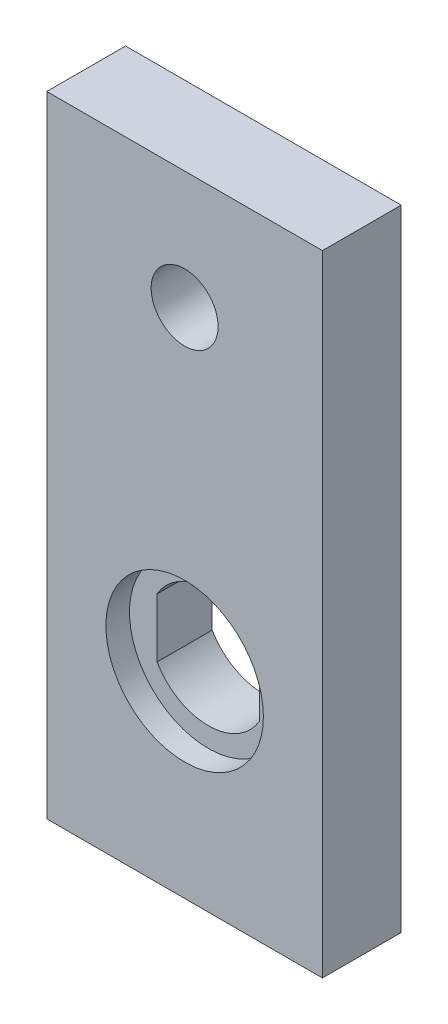
ISO-10303-21;
HEADER;
FILE_DESCRIPTION(('STEP AP214'),'2;1');
FILE_NAME('part.step','',(''),(''),'','','');
FILE_SCHEMA(('AUTOMOTIVE_DESIGN { 1 0 10303 214 1 1 1 1 }'));
ENDSEC;
DATA;
#1=APPLICATION_CONTEXT('core data for automotive mechanical design processes');
#2=APPLICATION_PROTOCOL_DEFINITION('international standard','automotive_design',2000,#1);
#3=PRODUCT_CONTEXT('',#1,'mechanical');
#4=PRODUCT('Part','Part','',(#3));
#5=PRODUCT_RELATED_PRODUCT_CATEGORY('part','',(#4));
#6=PRODUCT_DEFINITION_FORMATION('','',#4);
#7=PRODUCT_DEFINITION_CONTEXT('part definition',#1,'design');
#8=PRODUCT_DEFINITION('design','',#6,#7);
#9=PRODUCT_DEFINITION_SHAPE('','',#8);
#10=(LENGTH_UNIT() NAMED_UNIT(*) SI_UNIT(.MILLI.,.METRE.));
#11=(NAMED_UNIT(*) PLANE_ANGLE_UNIT() SI_UNIT($,.RADIAN.));
#12=(NAMED_UNIT(*) SI_UNIT($,.STERADIAN.) SOLID_ANGLE_UNIT());
#13=UNCERTAINTY_MEASURE_WITH_UNIT(LENGTH_MEASURE(1.E-05),#10,'distance_accuracy_value','');
#14=(GEOMETRIC_REPRESENTATION_CONTEXT(3) GLOBAL_UNCERTAINTY_ASSIGNED_CONTEXT((#13)) GLOBAL_UNIT_ASSIGNED_CONTEXT((#10,
#11,#12)) REPRESENTATION_CONTEXT('',''));
#15=CARTESIAN_POINT('',(0.,0.,0.));
#16=DIRECTION('',(0.,0.,1.));
#17=DIRECTION('',(1.,0.,0.));
#18=AXIS2_PLACEMENT_3D('',#15,#16,#17);
#19=CARTESIAN_POINT('',(-17.5,-40.,-5.));
#20=DIRECTION('',(-1.,0.,0.));
#21=DIRECTION('',(0.,0.,1.));
#22=AXIS2_PLACEMENT_3D('',#19,#20,#21);
#23=PLANE('',#22);
#24=DIRECTION('',(0.,-1.,0.));
#25=VECTOR('',#24,1.);
#26=CARTESIAN_POINT('',(-17.5,-40.,5.));
#27=LINE('',#26,#25);
#28=CARTESIAN_POINT('',(-17.5,40.,5.));
#29=VERTEX_POINT('',#28);
#30=CARTESIAN_POINT('',(-17.5,-40.,5.));
#31=VERTEX_POINT('',#30);
#32=EDGE_CURVE('E159',#29,#31,#27,.T.);
#33=ORIENTED_EDGE('',*,*,#32,.F.);
#34=DIRECTION('',(0.,0.,1.));
#35=VECTOR('',#34,1.);
#36=CARTESIAN_POINT('',(-17.5,40.,-5.));
#37=LINE('',#36,#35);
#38=CARTESIAN_POINT('',(-17.5,40.,-5.));
#39=VERTEX_POINT('',#38);
#40=EDGE_CURVE('E11',#39,#29,#37,.T.);
#41=ORIENTED_EDGE('',*,*,#40,.F.);
#42=DIRECTION('',(0.,-1.,0.));
#43=VECTOR('',#42,1.);
#44=CARTESIAN_POINT('',(-17.5,-40.,-5.));
#45=LINE('',#44,#43);
#46=CARTESIAN_POINT('',(-17.5,-40.,-5.));
#47=VERTEX_POINT('',#46);
#48=EDGE_CURVE('E163',#39,#47,#45,.T.);
#49=ORIENTED_EDGE('',*,*,#48,.T.);
#50=DIRECTION('',(0.,0.,1.));
#51=VECTOR('',#50,1.);
#52=CARTESIAN_POINT('',(-17.5,-40.,-5.));
#53=LINE('',#52,#51);
#54=EDGE_CURVE('E49',#47,#31,#53,.T.);
#55=ORIENTED_EDGE('',*,*,#54,.T.);
#56=EDGE_LOOP('',(#33,#41,#49,#55));
#57=FACE_BOUND('',#56,.T.);
#58=ADVANCED_FACE('F50',(#57),#23,.T.);
#59=CARTESIAN_POINT('',(17.5,40.,-5.));
#60=DIRECTION('',(0.,1.,0.));
#61=DIRECTION('',(-1.,0.,0.));
#62=AXIS2_PLACEMENT_3D('',#59,#60,#61);
#63=PLANE('',#62);
#64=DIRECTION('',(-1.,0.,0.));
#65=VECTOR('',#64,1.);
#66=CARTESIAN_POINT('',(17.5,40.,5.));
#67=LINE('',#66,#65);
#68=CARTESIAN_POINT('',(17.5,40.,5.));
#69=VERTEX_POINT('',#68);
#70=EDGE_CURVE('E164',#69,#29,#67,.T.);
#71=ORIENTED_EDGE('',*,*,#70,.F.);
#72=DIRECTION('',(0.,0.,1.));
#73=VECTOR('',#72,1.);
#74=CARTESIAN_POINT('',(17.5,40.,-5.));
#75=LINE('',#74,#73);
#76=CARTESIAN_POINT('',(17.5,40.,-5.));
#77=VERTEX_POINT('',#76);
#78=EDGE_CURVE('E54',#77,#69,#75,.T.);
#79=ORIENTED_EDGE('',*,*,#78,.F.);
#80=DIRECTION('',(-1.,0.,0.));
#81=VECTOR('',#80,1.);
#82=CARTESIAN_POINT('',(17.5,40.,-5.));
#83=LINE('',#82,#81);
#84=EDGE_CURVE('E171',#77,#39,#83,.T.);
#85=ORIENTED_EDGE('',*,*,#84,.T.);
#86=ORIENTED_EDGE('',*,*,#40,.T.);
#87=EDGE_LOOP('',(#71,#79,#85,#86));
#88=FACE_BOUND('',#87,.T.);
#89=ADVANCED_FACE('F200',(#88),#63,.T.);
#90=CARTESIAN_POINT('',(17.5,-40.,-5.));
#91=DIRECTION('',(1.,0.,0.));
#92=DIRECTION('',(0.,0.,-1.));
#93=AXIS2_PLACEMENT_3D('',#90,#91,#92);
#94=PLANE('',#93);
#95=DIRECTION('',(0.,1.,0.));
#96=VECTOR('',#95,1.);
#97=CARTESIAN_POINT('',(17.5,-40.,5.));
#98=LINE('',#97,#96);
#99=CARTESIAN_POINT('',(17.5,-40.,5.));
#100=VERTEX_POINT('',#99);
#101=EDGE_CURVE('E177',#100,#69,#98,.T.);
#102=ORIENTED_EDGE('',*,*,#101,.F.);
#103=DIRECTION('',(0.,0.,1.));
#104=VECTOR('',#103,1.);
#105=CARTESIAN_POINT('',(17.5,-40.,-5.));
#106=LINE('',#105,#104);
#107=CARTESIAN_POINT('',(17.5,-40.,-5.));
#108=VERTEX_POINT('',#107);
#109=EDGE_CURVE('E183',#108,#100,#106,.T.);
#110=ORIENTED_EDGE('',*,*,#109,.F.);
#111=DIRECTION('',(0.,1.,0.));
#112=VECTOR('',#111,1.);
#113=CARTESIAN_POINT('',(17.5,-40.,-5.));
#114=LINE('',#113,#112);
#115=EDGE_CURVE('E166',#108,#77,#114,.T.);
#116=ORIENTED_EDGE('',*,*,#115,.T.);
#117=ORIENTED_EDGE('',*,*,#78,.T.);
#118=EDGE_LOOP('',(#102,#110,#116,#117));
#119=FACE_BOUND('',#118,.T.);
#120=ADVANCED_FACE('F205',(#119),#94,.T.);
#121=CARTESIAN_POINT('',(17.5,-40.,-5.));
#122=DIRECTION('',(0.,-1.,0.));
#123=DIRECTION('',(1.,0.,0.));
#124=AXIS2_PLACEMENT_3D('',#121,#122,#123);
#125=PLANE('',#124);
#126=DIRECTION('',(1.,0.,0.));
#127=VECTOR('',#126,1.);
#128=CARTESIAN_POINT('',(17.5,-40.,5.));
#129=LINE('',#128,#127);
#130=EDGE_CURVE('E176',#31,#100,#129,.T.);
#131=ORIENTED_EDGE('',*,*,#130,.F.);
#132=ORIENTED_EDGE('',*,*,#54,.F.);
#133=DIRECTION('',(1.,0.,0.));
#134=VECTOR('',#133,1.);
#135=CARTESIAN_POINT('',(17.5,-40.,-5.));
#136=LINE('',#135,#134);
#137=EDGE_CURVE('E165',#47,#108,#136,.T.);
#138=ORIENTED_EDGE('',*,*,#137,.T.);
#139=ORIENTED_EDGE('',*,*,#109,.T.);
#140=EDGE_LOOP('',(#131,#132,#138,#139));
#141=FACE_BOUND('',#140,.T.);
#142=ADVANCED_FACE('F195',(#141),#125,.T.);
#143=CARTESIAN_POINT('',(0.,0.,-5.));
#144=DIRECTION('',(0.,0.,1.));
#145=DIRECTION('',(1.,0.,0.));
#146=AXIS2_PLACEMENT_3D('',#143,#144,#145);
#147=PLANE('',#146);
#148=DIRECTION('',(0.,1.,0.));
#149=VECTOR('',#148,1.);
#150=CARTESIAN_POINT('',(-6.5,0.,-5.));
#151=LINE('',#150,#149);
#152=CARTESIAN_POINT('',(-6.49999999999999,-18.741657386774,-5.));
#153=VERTEX_POINT('',#152);
#154=CARTESIAN_POINT('',(-6.49999999999999,-11.2583426132261,-5.));
#155=VERTEX_POINT('',#154);
#156=EDGE_CURVE('E121',#153,#155,#151,.T.);
#157=ORIENTED_EDGE('',*,*,#156,.F.);
#158=CARTESIAN_POINT('',(0.,-15.,-5.));
#159=DIRECTION('',(0.,0.,1.));
#160=DIRECTION('',(1.,0.,0.));
#161=AXIS2_PLACEMENT_3D('',#158,#159,#160);
#162=CIRCLE('',#161,7.5);
#163=CARTESIAN_POINT('',(6.5,-18.741657386774,-5.));
#164=VERTEX_POINT('',#163);
#165=EDGE_CURVE('E116',#153,#164,#162,.T.);
#166=ORIENTED_EDGE('',*,*,#165,.T.);
#167=DIRECTION('',(0.,1.,0.));
#168=VECTOR('',#167,1.);
#169=CARTESIAN_POINT('',(6.5,0.,-5.));
#170=LINE('',#169,#168);
#171=CARTESIAN_POINT('',(6.5,-11.2583426132261,-5.));
#172=VERTEX_POINT('',#171);
#173=EDGE_CURVE('E130',#164,#172,#170,.T.);
#174=ORIENTED_EDGE('',*,*,#173,.T.);
#175=EDGE_CURVE('E66',#172,#155,#162,.T.);
#176=ORIENTED_EDGE('',*,*,#175,.T.);
#177=EDGE_LOOP('',(#157,#166,#174,#176));
#178=FACE_BOUND('',#177,.T.);
#179=CARTESIAN_POINT('',(0.,25.,-5.));
#180=DIRECTION('',(0.,0.,1.));
#181=DIRECTION('',(1.,0.,0.));
#182=AXIS2_PLACEMENT_3D('',#179,#180,#181);
#183=CIRCLE('',#182,4.24999999999999);
#184=CARTESIAN_POINT('',(4.24999999999999,25.,-5.));
#185=VERTEX_POINT('',#184);
#186=EDGE_CURVE('E160',#185,#185,#183,.T.);
#187=ORIENTED_EDGE('',*,*,#186,.T.);
#188=EDGE_LOOP('',(#187));
#189=FACE_BOUND('',#188,.T.);
#190=ORIENTED_EDGE('',*,*,#48,.F.);
#191=ORIENTED_EDGE('',*,*,#84,.F.);
#192=ORIENTED_EDGE('',*,*,#115,.F.);
#193=ORIENTED_EDGE('',*,*,#137,.F.);
#194=EDGE_LOOP('',(#190,#191,#192,#193));
#195=FACE_BOUND('',#194,.T.);
#196=ADVANCED_FACE('F133',(#178,#189,#195),#147,.F.);
#197=CARTESIAN_POINT('',(0.,0.,5.));
#198=DIRECTION('',(0.,0.,1.));
#199=DIRECTION('',(1.,0.,0.));
#200=AXIS2_PLACEMENT_3D('',#197,#198,#199);
#201=PLANE('',#200);
#202=CARTESIAN_POINT('',(0.,-15.,5.));
#203=DIRECTION('',(0.,0.,1.));
#204=DIRECTION('',(1.,0.,0.));
#205=AXIS2_PLACEMENT_3D('',#202,#203,#204);
#206=CIRCLE('',#205,10.);
#207=CARTESIAN_POINT('',(10.,-15.,5.));
#208=VERTEX_POINT('',#207);
#209=EDGE_CURVE('E143',#208,#208,#206,.T.);
#210=ORIENTED_EDGE('',*,*,#209,.F.);
#211=EDGE_LOOP('',(#210));
#212=FACE_BOUND('',#211,.T.);
#213=CARTESIAN_POINT('',(0.,25.,5.));
#214=DIRECTION('',(0.,0.,1.));
#215=DIRECTION('',(1.,0.,0.));
#216=AXIS2_PLACEMENT_3D('',#213,#214,#215);
#217=CIRCLE('',#216,4.24999999999999);
#218=CARTESIAN_POINT('',(4.24999999999999,25.,5.));
#219=VERTEX_POINT('',#218);
#220=EDGE_CURVE('E152',#219,#219,#217,.T.);
#221=ORIENTED_EDGE('',*,*,#220,.F.);
#222=EDGE_LOOP('',(#221));
#223=FACE_BOUND('',#222,.T.);
#224=ORIENTED_EDGE('',*,*,#32,.T.);
#225=ORIENTED_EDGE('',*,*,#130,.T.);
#226=ORIENTED_EDGE('',*,*,#101,.T.);
#227=ORIENTED_EDGE('',*,*,#70,.T.);
#228=EDGE_LOOP('',(#224,#225,#226,#227));
#229=FACE_BOUND('',#228,.T.);
#230=ADVANCED_FACE('F193',(#212,#223,#229),#201,.T.);
#231=CARTESIAN_POINT('',(0.,25.,5.));
#232=DIRECTION('',(0.,0.,1.));
#233=DIRECTION('',(1.,0.,0.));
#234=AXIS2_PLACEMENT_3D('',#231,#232,#233);
#235=CYLINDRICAL_SURFACE('',#234,4.24999999999999);
#236=ORIENTED_EDGE('',*,*,#220,.T.);
#237=EDGE_LOOP('',(#236));
#238=FACE_BOUND('',#237,.T.);
#239=ORIENTED_EDGE('',*,*,#186,.F.);
#240=EDGE_LOOP('',(#239));
#241=FACE_BOUND('',#240,.T.);
#242=ADVANCED_FACE('F251',(#238,#241),#235,.F.);
#243=CARTESIAN_POINT('',(0.,-15.,2.));
#244=DIRECTION('',(0.,0.,1.));
#245=DIRECTION('',(1.,0.,0.));
#246=AXIS2_PLACEMENT_3D('',#243,#244,#245);
#247=CYLINDRICAL_SURFACE('',#246,10.);
#248=CARTESIAN_POINT('',(0.,-15.,2.));
#249=DIRECTION('',(0.,0.,1.));
#250=DIRECTION('',(1.,0.,0.));
#251=AXIS2_PLACEMENT_3D('',#248,#249,#250);
#252=CIRCLE('',#251,10.);
#253=CARTESIAN_POINT('',(10.,-15.,2.));
#254=VERTEX_POINT('',#253);
#255=EDGE_CURVE('E148',#254,#254,#252,.T.);
#256=ORIENTED_EDGE('',*,*,#255,.F.);
#257=EDGE_LOOP('',(#256));
#258=FACE_BOUND('',#257,.T.);
#259=ORIENTED_EDGE('',*,*,#209,.T.);
#260=EDGE_LOOP('',(#259));
#261=FACE_BOUND('',#260,.T.);
#262=ADVANCED_FACE('F270',(#258,#261),#247,.F.);
#263=CARTESIAN_POINT('',(0.,-15.,2.));
#264=DIRECTION('',(0.,0.,1.));
#265=DIRECTION('',(1.,0.,0.));
#266=AXIS2_PLACEMENT_3D('',#263,#264,#265);
#267=PLANE('',#266);
#268=CARTESIAN_POINT('',(0.,-15.,2.));
#269=DIRECTION('',(0.,0.,1.));
#270=DIRECTION('',(1.,0.,0.));
#271=AXIS2_PLACEMENT_3D('',#268,#269,#270);
#272=CIRCLE('',#271,7.5);
#273=CARTESIAN_POINT('',(-6.49999999999999,-18.741657386774,2.));
#274=VERTEX_POINT('',#273);
#275=CARTESIAN_POINT('',(6.5,-18.741657386774,2.));
#276=VERTEX_POINT('',#275);
#277=EDGE_CURVE('E118',#274,#276,#272,.T.);
#278=ORIENTED_EDGE('',*,*,#277,.F.);
#279=DIRECTION('',(0.,1.,0.));
#280=VECTOR('',#279,1.);
#281=CARTESIAN_POINT('',(-6.5,0.,2.));
#282=LINE('',#281,#280);
#283=CARTESIAN_POINT('',(-6.49999999999999,-11.2583426132261,2.));
#284=VERTEX_POINT('',#283);
#285=EDGE_CURVE('E131',#274,#284,#282,.T.);
#286=ORIENTED_EDGE('',*,*,#285,.T.);
#287=CARTESIAN_POINT('',(6.5,-11.2583426132261,2.));
#288=VERTEX_POINT('',#287);
#289=EDGE_CURVE('E62',#288,#284,#272,.T.);
#290=ORIENTED_EDGE('',*,*,#289,.F.);
#291=DIRECTION('',(0.,1.,0.));
#292=VECTOR('',#291,1.);
#293=CARTESIAN_POINT('',(6.5,0.,2.));
#294=LINE('',#293,#292);
#295=EDGE_CURVE('E142',#276,#288,#294,.T.);
#296=ORIENTED_EDGE('',*,*,#295,.F.);
#297=EDGE_LOOP('',(#278,#286,#290,#296));
#298=FACE_BOUND('',#297,.T.);
#299=ORIENTED_EDGE('',*,*,#255,.T.);
#300=EDGE_LOOP('',(#299));
#301=FACE_BOUND('',#300,.T.);
#302=ADVANCED_FACE('F280',(#298,#301),#267,.T.);
#303=CARTESIAN_POINT('',(0.,-15.,-5.));
#304=DIRECTION('',(0.,0.,1.));
#305=DIRECTION('',(1.,0.,0.));
#306=AXIS2_PLACEMENT_3D('',#303,#304,#305);
#307=CYLINDRICAL_SURFACE('',#306,7.5);
#308=ORIENTED_EDGE('',*,*,#277,.T.);
#309=DIRECTION('',(0.,0.,1.));
#310=VECTOR('',#309,1.);
#311=CARTESIAN_POINT('',(6.5,-18.741657386774,-5.));
#312=LINE('',#311,#310);
#313=EDGE_CURVE('E115',#164,#276,#312,.T.);
#314=ORIENTED_EDGE('',*,*,#313,.F.);
#315=ORIENTED_EDGE('',*,*,#165,.F.);
#316=DIRECTION('',(0.,0.,1.));
#317=VECTOR('',#316,1.);
#318=CARTESIAN_POINT('',(-6.49999999999999,-18.741657386774,-5.));
#319=LINE('',#318,#317);
#320=EDGE_CURVE('E141',#153,#274,#319,.T.);
#321=ORIENTED_EDGE('',*,*,#320,.T.);
#322=EDGE_LOOP('',(#308,#314,#315,#321));
#323=FACE_BOUND('',#322,.T.);
#324=ADVANCED_FACE('F112',(#323),#307,.F.);
#325=CARTESIAN_POINT('',(-6.5,0.,-5.));
#326=DIRECTION('',(1.,0.,0.));
#327=DIRECTION('',(0.,1.,0.));
#328=AXIS2_PLACEMENT_3D('',#325,#326,#327);
#329=PLANE('',#328);
#330=ORIENTED_EDGE('',*,*,#285,.F.);
#331=ORIENTED_EDGE('',*,*,#320,.F.);
#332=ORIENTED_EDGE('',*,*,#156,.T.);
#333=DIRECTION('',(0.,0.,1.));
#334=VECTOR('',#333,1.);
#335=CARTESIAN_POINT('',(-6.49999999999999,-11.2583426132261,-5.));
#336=LINE('',#335,#334);
#337=EDGE_CURVE('E146',#155,#284,#336,.T.);
#338=ORIENTED_EDGE('',*,*,#337,.T.);
#339=EDGE_LOOP('',(#330,#331,#332,#338));
#340=FACE_BOUND('',#339,.T.);
#341=ADVANCED_FACE('F294',(#340),#329,.T.);
#342=ORIENTED_EDGE('',*,*,#289,.T.);
#343=ORIENTED_EDGE('',*,*,#337,.F.);
#344=ORIENTED_EDGE('',*,*,#175,.F.);
#345=DIRECTION('',(0.,0.,1.));
#346=VECTOR('',#345,1.);
#347=CARTESIAN_POINT('',(6.5,-11.2583426132261,-5.));
#348=LINE('',#347,#346);
#349=EDGE_CURVE('E124',#172,#288,#348,.T.);
#350=ORIENTED_EDGE('',*,*,#349,.T.);
#351=EDGE_LOOP('',(#342,#343,#344,#350));
#352=FACE_BOUND('',#351,.T.);
#353=ADVANCED_FACE('F300',(#352),#307,.F.);
#354=CARTESIAN_POINT('',(6.5,0.,-5.));
#355=DIRECTION('',(1.,0.,0.));
#356=DIRECTION('',(0.,0.,-1.));
#357=AXIS2_PLACEMENT_3D('',#354,#355,#356);
#358=PLANE('',#357);
#359=ORIENTED_EDGE('',*,*,#295,.T.);
#360=ORIENTED_EDGE('',*,*,#349,.F.);
#361=ORIENTED_EDGE('',*,*,#173,.F.);
#362=ORIENTED_EDGE('',*,*,#313,.T.);
#363=EDGE_LOOP('',(#359,#360,#361,#362));
#364=FACE_BOUND('',#363,.T.);
#365=ADVANCED_FACE('F127',(#364),#358,.F.);
#366=CLOSED_SHELL('',(#58,#89,#120,#142,#196,#230,#242,#262,#302,#324,#341,#353,#365));
#367=MANIFOLD_SOLID_BREP('B2',#366);
#368=ADVANCED_BREP_SHAPE_REPRESENTATION('',(#18,#367),#14);
#369=SHAPE_DEFINITION_REPRESENTATION(#9,#368);
ENDSEC;
END-ISO-10303-21;
